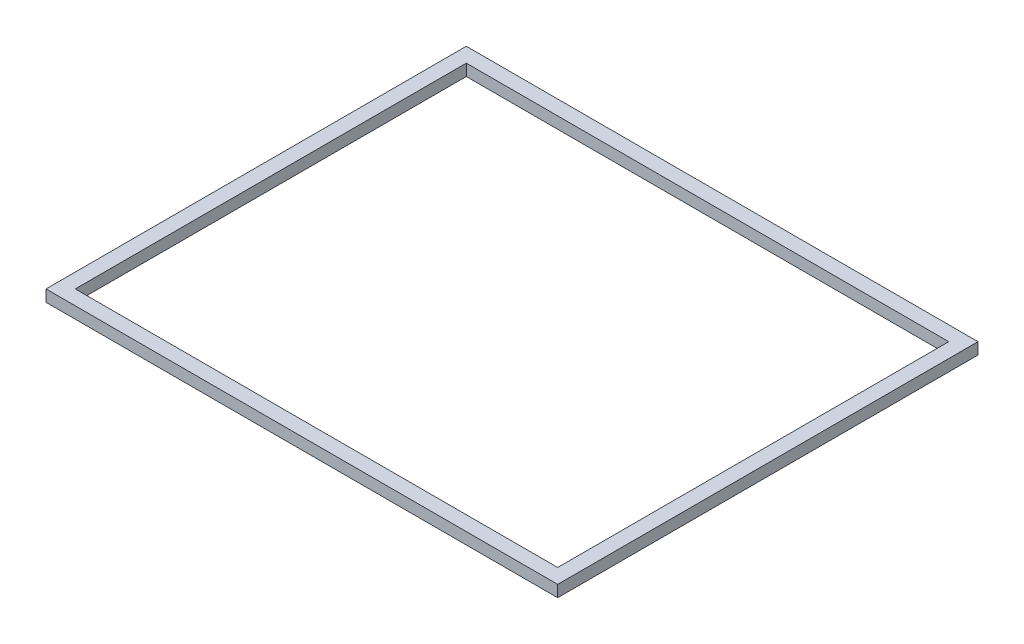
ISO-10303-21;
HEADER;
FILE_DESCRIPTION(('STEP AP214'),'2;1');
FILE_NAME('part.step','',(''),(''),'','','');
FILE_SCHEMA(('AUTOMOTIVE_DESIGN { 1 0 10303 214 1 1 1 1 }'));
ENDSEC;
DATA;
#1=APPLICATION_CONTEXT('core data for automotive mechanical design processes');
#2=APPLICATION_PROTOCOL_DEFINITION('international standard','automotive_design',2000,#1);
#3=PRODUCT_CONTEXT('',#1,'mechanical');
#4=PRODUCT('Part','Part','',(#3));
#5=PRODUCT_RELATED_PRODUCT_CATEGORY('part','',(#4));
#6=PRODUCT_DEFINITION_FORMATION('','',#4);
#7=PRODUCT_DEFINITION_CONTEXT('part definition',#1,'design');
#8=PRODUCT_DEFINITION('design','',#6,#7);
#9=PRODUCT_DEFINITION_SHAPE('','',#8);
#10=(LENGTH_UNIT() NAMED_UNIT(*) SI_UNIT(.MILLI.,.METRE.));
#11=(NAMED_UNIT(*) PLANE_ANGLE_UNIT() SI_UNIT($,.RADIAN.));
#12=(NAMED_UNIT(*) SI_UNIT($,.STERADIAN.) SOLID_ANGLE_UNIT());
#13=UNCERTAINTY_MEASURE_WITH_UNIT(LENGTH_MEASURE(1.E-05),#10,'distance_accuracy_value','');
#14=(GEOMETRIC_REPRESENTATION_CONTEXT(3) GLOBAL_UNCERTAINTY_ASSIGNED_CONTEXT((#13)) GLOBAL_UNIT_ASSIGNED_CONTEXT((#10,
#11,#12)) REPRESENTATION_CONTEXT('',''));
#15=CARTESIAN_POINT('',(0.,0.,0.));
#16=DIRECTION('',(0.,0.,1.));
#17=DIRECTION('',(1.,0.,0.));
#18=AXIS2_PLACEMENT_3D('',#15,#16,#17);
#19=CARTESIAN_POINT('',(0.,6.35,0.));
#20=DIRECTION('',(0.,-1.,0.));
#21=DIRECTION('',(0.,0.,-1.));
#22=AXIS2_PLACEMENT_3D('',#19,#20,#21);
#23=PLANE('',#22);
#24=DIRECTION('',(0.,0.,1.));
#25=VECTOR('',#24,1.);
#26=CARTESIAN_POINT('',(0.,6.35,0.));
#27=LINE('',#26,#25);
#28=CARTESIAN_POINT('',(0.,6.35,-230.));
#29=VERTEX_POINT('',#28);
#30=CARTESIAN_POINT('',(0.,6.35,0.));
#31=VERTEX_POINT('',#30);
#32=EDGE_CURVE('E153',#29,#31,#27,.T.);
#33=ORIENTED_EDGE('',*,*,#32,.T.);
#34=DIRECTION('',(1.,0.,0.));
#35=VECTOR('',#34,1.);
#36=CARTESIAN_POINT('',(0.,6.35,0.));
#37=LINE('',#36,#35);
#38=CARTESIAN_POINT('',(280.,6.35,0.));
#39=VERTEX_POINT('',#38);
#40=EDGE_CURVE('E157',#31,#39,#37,.T.);
#41=ORIENTED_EDGE('',*,*,#40,.T.);
#42=DIRECTION('',(0.,0.,-1.));
#43=VECTOR('',#42,1.);
#44=CARTESIAN_POINT('',(280.,6.35,0.));
#45=LINE('',#44,#43);
#46=CARTESIAN_POINT('',(280.,6.35,-230.));
#47=VERTEX_POINT('',#46);
#48=EDGE_CURVE('E161',#39,#47,#45,.T.);
#49=ORIENTED_EDGE('',*,*,#48,.T.);
#50=DIRECTION('',(-1.,0.,0.));
#51=VECTOR('',#50,1.);
#52=CARTESIAN_POINT('',(0.,6.35,-230.));
#53=LINE('',#52,#51);
#54=EDGE_CURVE('E164',#47,#29,#53,.T.);
#55=ORIENTED_EDGE('',*,*,#54,.T.);
#56=EDGE_LOOP('',(#33,#41,#49,#55));
#57=FACE_BOUND('',#56,.T.);
#58=DIRECTION('',(0.,0.,1.));
#59=VECTOR('',#58,1.);
#60=CARTESIAN_POINT('',(8.,6.35,-8.));
#61=LINE('',#60,#59);
#62=CARTESIAN_POINT('',(8.,6.35,-222.));
#63=VERTEX_POINT('',#62);
#64=CARTESIAN_POINT('',(8.,6.35,-8.));
#65=VERTEX_POINT('',#64);
#66=EDGE_CURVE('E105',#63,#65,#61,.T.);
#67=ORIENTED_EDGE('',*,*,#66,.F.);
#68=DIRECTION('',(-1.,0.,0.));
#69=VECTOR('',#68,1.);
#70=CARTESIAN_POINT('',(8.,6.35,-222.));
#71=LINE('',#70,#69);
#72=CARTESIAN_POINT('',(272.,6.35,-222.));
#73=VERTEX_POINT('',#72);
#74=EDGE_CURVE('E131',#73,#63,#71,.T.);
#75=ORIENTED_EDGE('',*,*,#74,.F.);
#76=DIRECTION('',(0.,0.,-1.));
#77=VECTOR('',#76,1.);
#78=CARTESIAN_POINT('',(272.,6.35,-8.));
#79=LINE('',#78,#77);
#80=CARTESIAN_POINT('',(272.,6.35,-8.));
#81=VERTEX_POINT('',#80);
#82=EDGE_CURVE('E127',#81,#73,#79,.T.);
#83=ORIENTED_EDGE('',*,*,#82,.F.);
#84=DIRECTION('',(1.,0.,0.));
#85=VECTOR('',#84,1.);
#86=CARTESIAN_POINT('',(8.,6.35,-8.));
#87=LINE('',#86,#85);
#88=EDGE_CURVE('E114',#65,#81,#87,.T.);
#89=ORIENTED_EDGE('',*,*,#88,.F.);
#90=EDGE_LOOP('',(#67,#75,#83,#89));
#91=FACE_BOUND('',#90,.T.);
#92=ADVANCED_FACE('F39',(#57,#91),#23,.F.);
#93=CARTESIAN_POINT('',(0.,0.,0.));
#94=DIRECTION('',(0.,-1.,0.));
#95=DIRECTION('',(0.,0.,-1.));
#96=AXIS2_PLACEMENT_3D('',#93,#94,#95);
#97=PLANE('',#96);
#98=DIRECTION('',(0.,0.,1.));
#99=VECTOR('',#98,1.);
#100=CARTESIAN_POINT('',(0.,0.,0.));
#101=LINE('',#100,#99);
#102=CARTESIAN_POINT('',(0.,0.,-230.));
#103=VERTEX_POINT('',#102);
#104=CARTESIAN_POINT('',(0.,0.,0.));
#105=VERTEX_POINT('',#104);
#106=EDGE_CURVE('E123',#103,#105,#101,.T.);
#107=ORIENTED_EDGE('',*,*,#106,.F.);
#108=DIRECTION('',(-1.,0.,0.));
#109=VECTOR('',#108,1.);
#110=CARTESIAN_POINT('',(0.,0.,-230.));
#111=LINE('',#110,#109);
#112=CARTESIAN_POINT('',(280.,0.,-230.));
#113=VERTEX_POINT('',#112);
#114=EDGE_CURVE('E158',#113,#103,#111,.T.);
#115=ORIENTED_EDGE('',*,*,#114,.F.);
#116=DIRECTION('',(0.,0.,-1.));
#117=VECTOR('',#116,1.);
#118=CARTESIAN_POINT('',(280.,0.,0.));
#119=LINE('',#118,#117);
#120=CARTESIAN_POINT('',(280.,0.,0.));
#121=VERTEX_POINT('',#120);
#122=EDGE_CURVE('E174',#121,#113,#119,.T.);
#123=ORIENTED_EDGE('',*,*,#122,.F.);
#124=DIRECTION('',(1.,0.,0.));
#125=VECTOR('',#124,1.);
#126=CARTESIAN_POINT('',(0.,0.,0.));
#127=LINE('',#126,#125);
#128=EDGE_CURVE('E171',#105,#121,#127,.T.);
#129=ORIENTED_EDGE('',*,*,#128,.F.);
#130=EDGE_LOOP('',(#107,#115,#123,#129));
#131=FACE_BOUND('',#130,.T.);
#132=DIRECTION('',(-1.,0.,0.));
#133=VECTOR('',#132,1.);
#134=CARTESIAN_POINT('',(8.,0.,-222.));
#135=LINE('',#134,#133);
#136=CARTESIAN_POINT('',(272.,0.,-222.));
#137=VERTEX_POINT('',#136);
#138=CARTESIAN_POINT('',(8.,0.,-222.));
#139=VERTEX_POINT('',#138);
#140=EDGE_CURVE('E115',#137,#139,#135,.T.);
#141=ORIENTED_EDGE('',*,*,#140,.T.);
#142=DIRECTION('',(0.,0.,1.));
#143=VECTOR('',#142,1.);
#144=CARTESIAN_POINT('',(8.,0.,-8.));
#145=LINE('',#144,#143);
#146=CARTESIAN_POINT('',(8.,0.,-8.));
#147=VERTEX_POINT('',#146);
#148=EDGE_CURVE('E63',#139,#147,#145,.T.);
#149=ORIENTED_EDGE('',*,*,#148,.T.);
#150=DIRECTION('',(1.,0.,0.));
#151=VECTOR('',#150,1.);
#152=CARTESIAN_POINT('',(8.,0.,-8.));
#153=LINE('',#152,#151);
#154=CARTESIAN_POINT('',(272.,0.,-8.));
#155=VERTEX_POINT('',#154);
#156=EDGE_CURVE('E121',#147,#155,#153,.T.);
#157=ORIENTED_EDGE('',*,*,#156,.T.);
#158=DIRECTION('',(0.,0.,-1.));
#159=VECTOR('',#158,1.);
#160=CARTESIAN_POINT('',(272.,0.,-8.));
#161=LINE('',#160,#159);
#162=EDGE_CURVE('E140',#155,#137,#161,.T.);
#163=ORIENTED_EDGE('',*,*,#162,.T.);
#164=EDGE_LOOP('',(#141,#149,#157,#163));
#165=FACE_BOUND('',#164,.T.);
#166=ADVANCED_FACE('F197',(#131,#165),#97,.T.);
#167=CARTESIAN_POINT('',(0.,6.35,0.));
#168=DIRECTION('',(1.,0.,0.));
#169=DIRECTION('',(0.,0.,-1.));
#170=AXIS2_PLACEMENT_3D('',#167,#168,#169);
#171=PLANE('',#170);
#172=ORIENTED_EDGE('',*,*,#106,.T.);
#173=DIRECTION('',(0.,-1.,0.));
#174=VECTOR('',#173,1.);
#175=CARTESIAN_POINT('',(0.,6.35,0.));
#176=LINE('',#175,#174);
#177=EDGE_CURVE('E11',#31,#105,#176,.T.);
#178=ORIENTED_EDGE('',*,*,#177,.F.);
#179=ORIENTED_EDGE('',*,*,#32,.F.);
#180=DIRECTION('',(0.,-1.,0.));
#181=VECTOR('',#180,1.);
#182=CARTESIAN_POINT('',(0.,6.35,-230.));
#183=LINE('',#182,#181);
#184=EDGE_CURVE('E167',#29,#103,#183,.T.);
#185=ORIENTED_EDGE('',*,*,#184,.T.);
#186=EDGE_LOOP('',(#172,#178,#179,#185));
#187=FACE_BOUND('',#186,.T.);
#188=ADVANCED_FACE('F41',(#187),#171,.F.);
#189=CARTESIAN_POINT('',(0.,6.35,0.));
#190=DIRECTION('',(0.,0.,-1.));
#191=DIRECTION('',(-1.,0.,0.));
#192=AXIS2_PLACEMENT_3D('',#189,#190,#191);
#193=PLANE('',#192);
#194=ORIENTED_EDGE('',*,*,#128,.T.);
#195=DIRECTION('',(0.,-1.,0.));
#196=VECTOR('',#195,1.);
#197=CARTESIAN_POINT('',(280.,6.35,0.));
#198=LINE('',#197,#196);
#199=EDGE_CURVE('E48',#39,#121,#198,.T.);
#200=ORIENTED_EDGE('',*,*,#199,.F.);
#201=ORIENTED_EDGE('',*,*,#40,.F.);
#202=ORIENTED_EDGE('',*,*,#177,.T.);
#203=EDGE_LOOP('',(#194,#200,#201,#202));
#204=FACE_BOUND('',#203,.T.);
#205=ADVANCED_FACE('F207',(#204),#193,.F.);
#206=CARTESIAN_POINT('',(280.,6.35,0.));
#207=DIRECTION('',(-1.,0.,0.));
#208=DIRECTION('',(0.,0.,1.));
#209=AXIS2_PLACEMENT_3D('',#206,#207,#208);
#210=PLANE('',#209);
#211=ORIENTED_EDGE('',*,*,#122,.T.);
#212=DIRECTION('',(0.,-1.,0.));
#213=VECTOR('',#212,1.);
#214=CARTESIAN_POINT('',(280.,6.35,-230.));
#215=LINE('',#214,#213);
#216=EDGE_CURVE('E182',#47,#113,#215,.T.);
#217=ORIENTED_EDGE('',*,*,#216,.F.);
#218=ORIENTED_EDGE('',*,*,#48,.F.);
#219=ORIENTED_EDGE('',*,*,#199,.T.);
#220=EDGE_LOOP('',(#211,#217,#218,#219));
#221=FACE_BOUND('',#220,.T.);
#222=ADVANCED_FACE('F191',(#221),#210,.F.);
#223=CARTESIAN_POINT('',(0.,6.35,-230.));
#224=DIRECTION('',(0.,0.,1.));
#225=DIRECTION('',(1.,0.,0.));
#226=AXIS2_PLACEMENT_3D('',#223,#224,#225);
#227=PLANE('',#226);
#228=ORIENTED_EDGE('',*,*,#114,.T.);
#229=ORIENTED_EDGE('',*,*,#184,.F.);
#230=ORIENTED_EDGE('',*,*,#54,.F.);
#231=ORIENTED_EDGE('',*,*,#216,.T.);
#232=EDGE_LOOP('',(#228,#229,#230,#231));
#233=FACE_BOUND('',#232,.T.);
#234=ADVANCED_FACE('F201',(#233),#227,.F.);
#235=CARTESIAN_POINT('',(8.,6.35,-8.));
#236=DIRECTION('',(1.,0.,0.));
#237=DIRECTION('',(0.,0.,-1.));
#238=AXIS2_PLACEMENT_3D('',#235,#236,#237);
#239=PLANE('',#238);
#240=ORIENTED_EDGE('',*,*,#148,.F.);
#241=DIRECTION('',(0.,-1.,0.));
#242=VECTOR('',#241,1.);
#243=CARTESIAN_POINT('',(8.,6.35,-222.));
#244=LINE('',#243,#242);
#245=EDGE_CURVE('E109',#63,#139,#244,.T.);
#246=ORIENTED_EDGE('',*,*,#245,.F.);
#247=ORIENTED_EDGE('',*,*,#66,.T.);
#248=DIRECTION('',(0.,-1.,0.));
#249=VECTOR('',#248,1.);
#250=CARTESIAN_POINT('',(8.,6.35,-8.));
#251=LINE('',#250,#249);
#252=EDGE_CURVE('E108',#65,#147,#251,.T.);
#253=ORIENTED_EDGE('',*,*,#252,.T.);
#254=EDGE_LOOP('',(#240,#246,#247,#253));
#255=FACE_BOUND('',#254,.T.);
#256=ADVANCED_FACE('F107',(#255),#239,.T.);
#257=CARTESIAN_POINT('',(8.,6.35,-8.));
#258=DIRECTION('',(0.,0.,-1.));
#259=DIRECTION('',(-1.,0.,0.));
#260=AXIS2_PLACEMENT_3D('',#257,#258,#259);
#261=PLANE('',#260);
#262=ORIENTED_EDGE('',*,*,#156,.F.);
#263=ORIENTED_EDGE('',*,*,#252,.F.);
#264=ORIENTED_EDGE('',*,*,#88,.T.);
#265=DIRECTION('',(0.,-1.,0.));
#266=VECTOR('',#265,1.);
#267=CARTESIAN_POINT('',(272.,6.35,-8.));
#268=LINE('',#267,#266);
#269=EDGE_CURVE('E124',#81,#155,#268,.T.);
#270=ORIENTED_EDGE('',*,*,#269,.T.);
#271=EDGE_LOOP('',(#262,#263,#264,#270));
#272=FACE_BOUND('',#271,.T.);
#273=ADVANCED_FACE('F118',(#272),#261,.T.);
#274=CARTESIAN_POINT('',(272.,6.35,-8.));
#275=DIRECTION('',(-1.,0.,0.));
#276=DIRECTION('',(0.,0.,1.));
#277=AXIS2_PLACEMENT_3D('',#274,#275,#276);
#278=PLANE('',#277);
#279=ORIENTED_EDGE('',*,*,#162,.F.);
#280=ORIENTED_EDGE('',*,*,#269,.F.);
#281=ORIENTED_EDGE('',*,*,#82,.T.);
#282=DIRECTION('',(0.,-1.,0.));
#283=VECTOR('',#282,1.);
#284=CARTESIAN_POINT('',(272.,6.35,-222.));
#285=LINE('',#284,#283);
#286=EDGE_CURVE('E55',#73,#137,#285,.T.);
#287=ORIENTED_EDGE('',*,*,#286,.T.);
#288=EDGE_LOOP('',(#279,#280,#281,#287));
#289=FACE_BOUND('',#288,.T.);
#290=ADVANCED_FACE('F230',(#289),#278,.T.);
#291=CARTESIAN_POINT('',(8.,6.35,-222.));
#292=DIRECTION('',(0.,0.,1.));
#293=DIRECTION('',(1.,0.,0.));
#294=AXIS2_PLACEMENT_3D('',#291,#292,#293);
#295=PLANE('',#294);
#296=ORIENTED_EDGE('',*,*,#140,.F.);
#297=ORIENTED_EDGE('',*,*,#286,.F.);
#298=ORIENTED_EDGE('',*,*,#74,.T.);
#299=ORIENTED_EDGE('',*,*,#245,.T.);
#300=EDGE_LOOP('',(#296,#297,#298,#299));
#301=FACE_BOUND('',#300,.T.);
#302=ADVANCED_FACE('F234',(#301),#295,.T.);
#303=CLOSED_SHELL('',(#92,#166,#188,#205,#222,#234,#256,#273,#290,#302));
#304=MANIFOLD_SOLID_BREP('B2',#303);
#305=ADVANCED_BREP_SHAPE_REPRESENTATION('',(#18,#304),#14);
#306=SHAPE_DEFINITION_REPRESENTATION(#9,#305);
ENDSEC;
END-ISO-10303-21;
